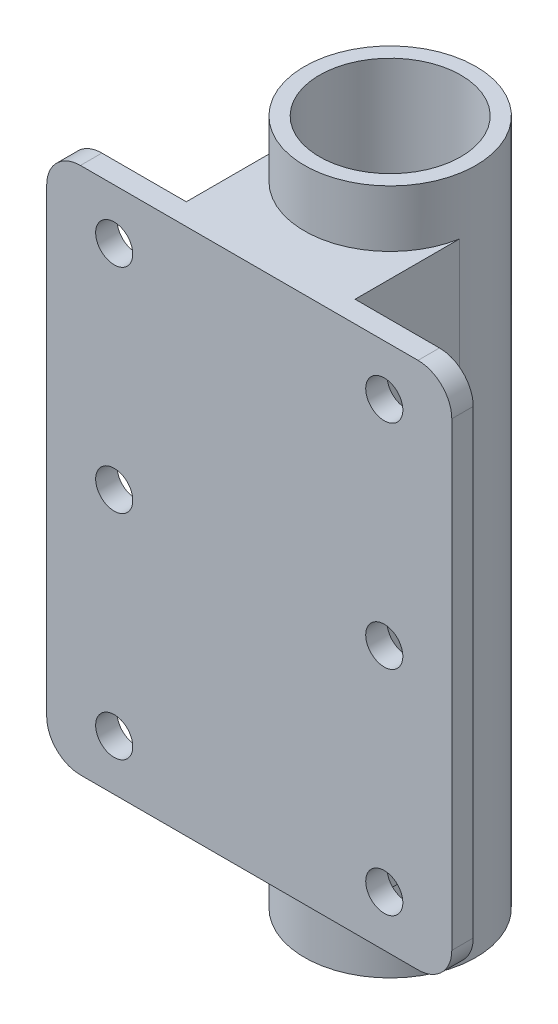
ISO-10303-21;
HEADER;
FILE_DESCRIPTION(('STEP AP214'),'2;1');
FILE_NAME('part.step','',(''),(''),'','','');
FILE_SCHEMA(('AUTOMOTIVE_DESIGN { 1 0 10303 214 1 1 1 1 }'));
ENDSEC;
DATA;
#1=APPLICATION_CONTEXT('core data for automotive mechanical design processes');
#2=APPLICATION_PROTOCOL_DEFINITION('international standard','automotive_design',2000,#1);
#3=PRODUCT_CONTEXT('',#1,'mechanical');
#4=PRODUCT('Part','Part','',(#3));
#5=PRODUCT_RELATED_PRODUCT_CATEGORY('part','',(#4));
#6=PRODUCT_DEFINITION_FORMATION('','',#4);
#7=PRODUCT_DEFINITION_CONTEXT('part definition',#1,'design');
#8=PRODUCT_DEFINITION('design','',#6,#7);
#9=PRODUCT_DEFINITION_SHAPE('','',#8);
#10=(LENGTH_UNIT() NAMED_UNIT(*) SI_UNIT(.MILLI.,.METRE.));
#11=(NAMED_UNIT(*) PLANE_ANGLE_UNIT() SI_UNIT($,.RADIAN.));
#12=(NAMED_UNIT(*) SI_UNIT($,.STERADIAN.) SOLID_ANGLE_UNIT());
#13=UNCERTAINTY_MEASURE_WITH_UNIT(LENGTH_MEASURE(1.E-05),#10,'distance_accuracy_value','');
#14=(GEOMETRIC_REPRESENTATION_CONTEXT(3) GLOBAL_UNCERTAINTY_ASSIGNED_CONTEXT((#13)) GLOBAL_UNIT_ASSIGNED_CONTEXT((#10,
#11,#12)) REPRESENTATION_CONTEXT('',''));
#15=CARTESIAN_POINT('',(0.,0.,0.));
#16=DIRECTION('',(0.,0.,1.));
#17=DIRECTION('',(1.,0.,0.));
#18=AXIS2_PLACEMENT_3D('',#15,#16,#17);
#19=CARTESIAN_POINT('',(0.,0.,0.));
#20=DIRECTION('',(0.,-1.,0.));
#21=DIRECTION('',(0.,0.,-1.));
#22=AXIS2_PLACEMENT_3D('',#19,#20,#21);
#23=CYLINDRICAL_SURFACE('',#22,25.3999999938142);
#24=CARTESIAN_POINT('',(0.,3.11380453483725E-11,0.));
#25=DIRECTION('',(0.,-1.,0.));
#26=DIRECTION('',(0.,0.,-1.));
#27=AXIS2_PLACEMENT_3D('',#24,#25,#26);
#28=CIRCLE('',#27,25.3999999937946);
#29=CARTESIAN_POINT('',(0.,3.11380453483725E-11,-25.3999999937946));
#30=VERTEX_POINT('',#29);
#31=EDGE_CURVE('E245',#30,#30,#28,.T.);
#32=ORIENTED_EDGE('',*,*,#31,.F.);
#33=EDGE_LOOP('',(#32));
#34=FACE_BOUND('',#33,.T.);
#35=CARTESIAN_POINT('',(0.,203.199999999963,0.));
#36=DIRECTION('',(0.,-1.,0.));
#37=DIRECTION('',(0.,0.,-1.));
#38=AXIS2_PLACEMENT_3D('',#35,#36,#37);
#39=CIRCLE('',#38,25.3999999938337);
#40=CARTESIAN_POINT('',(0.,203.199999999963,-25.3999999938337));
#41=VERTEX_POINT('',#40);
#42=EDGE_CURVE('E242',#41,#41,#39,.T.);
#43=ORIENTED_EDGE('',*,*,#42,.T.);
#44=EDGE_LOOP('',(#43));
#45=FACE_BOUND('',#44,.T.);
#46=DIRECTION('',(0.,-1.,0.));
#47=VECTOR('',#46,1.);
#48=CARTESIAN_POINT('',(-25.,214.272647380034,4.48998882902464));
#49=LINE('',#48,#47);
#50=CARTESIAN_POINT('',(-25.,186.374999999963,4.48998882902464));
#51=VERTEX_POINT('',#50);
#52=CARTESIAN_POINT('',(-25.,30.0000000000311,4.48998882902464));
#53=VERTEX_POINT('',#52);
#54=EDGE_CURVE('E179',#51,#53,#49,.T.);
#55=ORIENTED_EDGE('',*,*,#54,.F.);
#56=CARTESIAN_POINT('',(0.,186.374999999963,0.));
#57=DIRECTION('',(0.,-1.,0.));
#58=DIRECTION('',(0.,0.,1.));
#59=AXIS2_PLACEMENT_3D('',#56,#57,#58);
#60=CIRCLE('',#59,25.3999999937946);
#61=CARTESIAN_POINT('',(25.,186.374999999963,4.48998882902464));
#62=VERTEX_POINT('',#61);
#63=EDGE_CURVE('E309',#62,#51,#60,.T.);
#64=ORIENTED_EDGE('',*,*,#63,.F.);
#65=DIRECTION('',(0.,-1.,0.));
#66=VECTOR('',#65,1.);
#67=CARTESIAN_POINT('',(25.,214.272647380034,4.48998882902464));
#68=LINE('',#67,#66);
#69=CARTESIAN_POINT('',(25.,30.0000000000311,4.48998882913527));
#70=VERTEX_POINT('',#69);
#71=EDGE_CURVE('E206',#62,#70,#68,.T.);
#72=ORIENTED_EDGE('',*,*,#71,.T.);
#73=CARTESIAN_POINT('',(0.,30.0000000000311,0.));
#74=DIRECTION('',(0.,-1.,0.));
#75=DIRECTION('',(0.,0.,-1.));
#76=AXIS2_PLACEMENT_3D('',#73,#74,#75);
#77=CIRCLE('',#76,25.3999999937946);
#78=EDGE_CURVE('E200',#70,#53,#77,.T.);
#79=ORIENTED_EDGE('',*,*,#78,.T.);
#80=EDGE_LOOP('',(#55,#64,#72,#79));
#81=FACE_BOUND('',#80,.T.);
#82=ADVANCED_FACE('F48',(#34,#45,#81),#23,.T.);
#83=CARTESIAN_POINT('',(-20.955,3.11393374928046E-11,0.));
#84=DIRECTION('',(0.,1.,0.));
#85=DIRECTION('',(0.,0.,1.));
#86=AXIS2_PLACEMENT_3D('',#83,#84,#85);
#87=PLANE('',#86);
#88=CARTESIAN_POINT('',(0.,3.11406296372367E-11,0.));
#89=DIRECTION('',(0.,-1.,0.));
#90=DIRECTION('',(0.,0.,-1.));
#91=AXIS2_PLACEMENT_3D('',#88,#89,#90);
#92=CIRCLE('',#91,20.955);
#93=CARTESIAN_POINT('',(0.,3.11406296372367E-11,-20.955));
#94=VERTEX_POINT('',#93);
#95=EDGE_CURVE('E223',#94,#94,#92,.T.);
#96=ORIENTED_EDGE('',*,*,#95,.F.);
#97=EDGE_LOOP('',(#96));
#98=FACE_BOUND('',#97,.T.);
#99=ORIENTED_EDGE('',*,*,#31,.T.);
#100=EDGE_LOOP('',(#99));
#101=FACE_BOUND('',#100,.T.);
#102=ADVANCED_FACE('F367',(#98,#101),#87,.F.);
#103=CARTESIAN_POINT('',(-20.9550000000491,203.199999999963,0.));
#104=DIRECTION('',(0.,-1.,0.));
#105=DIRECTION('',(0.,0.,-1.));
#106=AXIS2_PLACEMENT_3D('',#103,#104,#105);
#107=PLANE('',#106);
#108=ORIENTED_EDGE('',*,*,#42,.F.);
#109=EDGE_LOOP('',(#108));
#110=FACE_BOUND('',#109,.T.);
#111=CARTESIAN_POINT('',(0.,203.199999999963,0.));
#112=DIRECTION('',(0.,-1.,0.));
#113=DIRECTION('',(0.,0.,-1.));
#114=AXIS2_PLACEMENT_3D('',#111,#112,#113);
#115=CIRCLE('',#114,20.9550000000491);
#116=CARTESIAN_POINT('',(0.,203.199999999963,-20.9550000000491));
#117=VERTEX_POINT('',#116);
#118=EDGE_CURVE('E239',#117,#117,#115,.T.);
#119=ORIENTED_EDGE('',*,*,#118,.T.);
#120=EDGE_LOOP('',(#119));
#121=FACE_BOUND('',#120,.T.);
#122=ADVANCED_FACE('F372',(#110,#121),#107,.F.);
#123=CARTESIAN_POINT('',(0.,0.,0.));
#124=DIRECTION('',(0.,-1.,0.));
#125=DIRECTION('',(0.,0.,-1.));
#126=AXIS2_PLACEMENT_3D('',#123,#124,#125);
#127=CYLINDRICAL_SURFACE('',#126,20.9550000000491);
#128=ORIENTED_EDGE('',*,*,#118,.F.);
#129=EDGE_LOOP('',(#128));
#130=FACE_BOUND('',#129,.T.);
#131=CARTESIAN_POINT('',(0.,165.099999999963,0.));
#132=DIRECTION('',(0.,-1.,0.));
#133=DIRECTION('',(0.,0.,-1.));
#134=AXIS2_PLACEMENT_3D('',#131,#132,#133);
#135=CIRCLE('',#134,20.9550000000491);
#136=CARTESIAN_POINT('',(0.,165.099999999963,-20.9550000000491));
#137=VERTEX_POINT('',#136);
#138=EDGE_CURVE('E236',#137,#137,#135,.T.);
#139=ORIENTED_EDGE('',*,*,#138,.T.);
#140=EDGE_LOOP('',(#139));
#141=FACE_BOUND('',#140,.T.);
#142=ADVANCED_FACE('F513',(#130,#141),#127,.F.);
#143=CARTESIAN_POINT('',(-19.177000000049,165.099999999963,0.));
#144=DIRECTION('',(0.,-1.,0.));
#145=DIRECTION('',(0.,0.,-1.));
#146=AXIS2_PLACEMENT_3D('',#143,#144,#145);
#147=PLANE('',#146);
#148=ORIENTED_EDGE('',*,*,#138,.F.);
#149=EDGE_LOOP('',(#148));
#150=FACE_BOUND('',#149,.T.);
#151=CARTESIAN_POINT('',(0.,165.099999999963,0.));
#152=DIRECTION('',(0.,-1.,0.));
#153=DIRECTION('',(0.,0.,-1.));
#154=AXIS2_PLACEMENT_3D('',#151,#152,#153);
#155=CIRCLE('',#154,19.177000000049);
#156=CARTESIAN_POINT('',(0.,165.099999999963,-19.177000000049));
#157=VERTEX_POINT('',#156);
#158=EDGE_CURVE('E233',#157,#157,#155,.T.);
#159=ORIENTED_EDGE('',*,*,#158,.T.);
#160=EDGE_LOOP('',(#159));
#161=FACE_BOUND('',#160,.T.);
#162=ADVANCED_FACE('F509',(#150,#161),#147,.F.);
#163=CARTESIAN_POINT('',(0.,0.,0.));
#164=DIRECTION('',(0.,-1.,0.));
#165=DIRECTION('',(0.,0.,-1.));
#166=AXIS2_PLACEMENT_3D('',#163,#164,#165);
#167=CYLINDRICAL_SURFACE('',#166,19.177000000049);
#168=ORIENTED_EDGE('',*,*,#158,.F.);
#169=EDGE_LOOP('',(#168));
#170=FACE_BOUND('',#169,.T.);
#171=CARTESIAN_POINT('',(0.,38.0999999999633,0.));
#172=DIRECTION('',(0.,-1.,0.));
#173=DIRECTION('',(0.,0.,-1.));
#174=AXIS2_PLACEMENT_3D('',#171,#172,#173);
#175=CIRCLE('',#174,19.177000000049);
#176=CARTESIAN_POINT('',(0.,38.0999999999633,-19.177000000049));
#177=VERTEX_POINT('',#176);
#178=EDGE_CURVE('E230',#177,#177,#175,.T.);
#179=ORIENTED_EDGE('',*,*,#178,.T.);
#180=EDGE_LOOP('',(#179));
#181=FACE_BOUND('',#180,.T.);
#182=ADVANCED_FACE('F505',(#170,#181),#167,.F.);
#183=CARTESIAN_POINT('',(-20.955,38.0999999999972,0.));
#184=DIRECTION('',(0.,1.,0.));
#185=DIRECTION('',(0.,0.,1.));
#186=AXIS2_PLACEMENT_3D('',#183,#184,#185);
#187=PLANE('',#186);
#188=ORIENTED_EDGE('',*,*,#178,.F.);
#189=EDGE_LOOP('',(#188));
#190=FACE_BOUND('',#189,.T.);
#191=CARTESIAN_POINT('',(0.,38.1000000000311,0.));
#192=DIRECTION('',(0.,-1.,0.));
#193=DIRECTION('',(0.,0.,-1.));
#194=AXIS2_PLACEMENT_3D('',#191,#192,#193);
#195=CIRCLE('',#194,20.955);
#196=CARTESIAN_POINT('',(0.,38.1000000000311,-20.955));
#197=VERTEX_POINT('',#196);
#198=EDGE_CURVE('E227',#197,#197,#195,.T.);
#199=ORIENTED_EDGE('',*,*,#198,.T.);
#200=EDGE_LOOP('',(#199));
#201=FACE_BOUND('',#200,.T.);
#202=ADVANCED_FACE('F501',(#190,#201),#187,.F.);
#203=CARTESIAN_POINT('',(0.,0.,0.));
#204=DIRECTION('',(0.,-1.,0.));
#205=DIRECTION('',(0.,0.,-1.));
#206=AXIS2_PLACEMENT_3D('',#203,#204,#205);
#207=CYLINDRICAL_SURFACE('',#206,20.955);
#208=ORIENTED_EDGE('',*,*,#198,.F.);
#209=EDGE_LOOP('',(#208));
#210=FACE_BOUND('',#209,.T.);
#211=ORIENTED_EDGE('',*,*,#95,.T.);
#212=EDGE_LOOP('',(#211));
#213=FACE_BOUND('',#212,.T.);
#214=ADVANCED_FACE('F498',(#210,#213),#207,.F.);
#215=CARTESIAN_POINT('',(0.,30.0000000000311,0.));
#216=DIRECTION('',(0.,-1.,0.));
#217=DIRECTION('',(0.,0.,-1.));
#218=AXIS2_PLACEMENT_3D('',#215,#216,#217);
#219=PLANE('',#218);
#220=DIRECTION('',(1.,0.,0.));
#221=VECTOR('',#220,1.);
#222=CARTESIAN_POINT('',(-60.,30.0000000000311,35.3999999937946));
#223=LINE('',#222,#221);
#224=CARTESIAN_POINT('',(25.,30.0000000000311,35.3999999937946));
#225=VERTEX_POINT('',#224);
#226=CARTESIAN_POINT('',(50.,30.0000000000311,35.3999999937946));
#227=VERTEX_POINT('',#226);
#228=EDGE_CURVE('E171',#225,#227,#223,.T.);
#229=ORIENTED_EDGE('',*,*,#228,.T.);
#230=DIRECTION('',(0.,0.,-1.));
#231=VECTOR('',#230,1.);
#232=CARTESIAN_POINT('',(50.,30.0000000000311,41.7499999937946));
#233=LINE('',#232,#231);
#234=CARTESIAN_POINT('',(50.,30.0000000000311,41.7499999937946));
#235=VERTEX_POINT('',#234);
#236=EDGE_CURVE('E12',#227,#235,#233,.F.);
#237=ORIENTED_EDGE('',*,*,#236,.T.);
#238=DIRECTION('',(1.,0.,0.));
#239=VECTOR('',#238,1.);
#240=CARTESIAN_POINT('',(-60.,30.0000000000311,41.7499999937946));
#241=LINE('',#240,#239);
#242=CARTESIAN_POINT('',(-50.,30.0000000000311,41.7499999937946));
#243=VERTEX_POINT('',#242);
#244=EDGE_CURVE('E292',#243,#235,#241,.T.);
#245=ORIENTED_EDGE('',*,*,#244,.F.);
#246=DIRECTION('',(0.,0.,-1.));
#247=VECTOR('',#246,1.);
#248=CARTESIAN_POINT('',(-50.,30.0000000000311,35.3999999937946));
#249=LINE('',#248,#247);
#250=CARTESIAN_POINT('',(-50.,30.0000000000311,35.3999999937946));
#251=VERTEX_POINT('',#250);
#252=EDGE_CURVE('E57',#243,#251,#249,.T.);
#253=ORIENTED_EDGE('',*,*,#252,.T.);
#254=CARTESIAN_POINT('',(-25.,30.0000000000311,35.3999999937946));
#255=VERTEX_POINT('',#254);
#256=EDGE_CURVE('E162',#251,#255,#223,.T.);
#257=ORIENTED_EDGE('',*,*,#256,.T.);
#258=DIRECTION('',(0.,0.,-1.));
#259=VECTOR('',#258,1.);
#260=CARTESIAN_POINT('',(-25.,30.0000000000311,0.));
#261=LINE('',#260,#259);
#262=EDGE_CURVE('E165',#255,#53,#261,.T.);
#263=ORIENTED_EDGE('',*,*,#262,.T.);
#264=ORIENTED_EDGE('',*,*,#78,.F.);
#265=DIRECTION('',(0.,0.,-1.));
#266=VECTOR('',#265,1.);
#267=CARTESIAN_POINT('',(25.,30.0000000000311,0.));
#268=LINE('',#267,#266);
#269=EDGE_CURVE('E197',#225,#70,#268,.T.);
#270=ORIENTED_EDGE('',*,*,#269,.F.);
#271=EDGE_LOOP('',(#229,#237,#245,#253,#257,#263,#264,#270));
#272=FACE_BOUND('',#271,.T.);
#273=ADVANCED_FACE('F164',(#272),#219,.T.);
#274=CARTESIAN_POINT('',(25.,214.272647380034,0.));
#275=DIRECTION('',(-1.,0.,0.));
#276=DIRECTION('',(0.,0.,1.));
#277=AXIS2_PLACEMENT_3D('',#274,#275,#276);
#278=PLANE('',#277);
#279=ORIENTED_EDGE('',*,*,#71,.F.);
#280=DIRECTION('',(0.,0.,-1.));
#281=VECTOR('',#280,1.);
#282=CARTESIAN_POINT('',(25.,186.374999999963,35.3999999937946));
#283=LINE('',#282,#281);
#284=CARTESIAN_POINT('',(25.,186.374999999963,35.3999999937946));
#285=VERTEX_POINT('',#284);
#286=EDGE_CURVE('E195',#285,#62,#283,.T.);
#287=ORIENTED_EDGE('',*,*,#286,.F.);
#288=DIRECTION('',(0.,-1.,0.));
#289=VECTOR('',#288,1.);
#290=CARTESIAN_POINT('',(25.,214.272647380034,35.3999999937946));
#291=LINE('',#290,#289);
#292=EDGE_CURVE('E201',#285,#225,#291,.T.);
#293=ORIENTED_EDGE('',*,*,#292,.T.);
#294=ORIENTED_EDGE('',*,*,#269,.T.);
#295=EDGE_LOOP('',(#279,#287,#293,#294));
#296=FACE_BOUND('',#295,.T.);
#297=ADVANCED_FACE('F380',(#296),#278,.F.);
#298=CARTESIAN_POINT('',(-25.,214.272647380034,0.));
#299=DIRECTION('',(-1.,0.,0.));
#300=DIRECTION('',(0.,0.,1.));
#301=AXIS2_PLACEMENT_3D('',#298,#299,#300);
#302=PLANE('',#301);
#303=DIRECTION('',(0.,-1.,0.));
#304=VECTOR('',#303,1.);
#305=CARTESIAN_POINT('',(-25.,214.272647380034,35.3999999937946));
#306=LINE('',#305,#304);
#307=CARTESIAN_POINT('',(-25.,186.374999999963,35.3999999937946));
#308=VERTEX_POINT('',#307);
#309=EDGE_CURVE('E177',#308,#255,#306,.T.);
#310=ORIENTED_EDGE('',*,*,#309,.F.);
#311=DIRECTION('',(0.,0.,1.));
#312=VECTOR('',#311,1.);
#313=CARTESIAN_POINT('',(-25.,186.374999999963,4.48998882902464));
#314=LINE('',#313,#312);
#315=EDGE_CURVE('E312',#51,#308,#314,.T.);
#316=ORIENTED_EDGE('',*,*,#315,.F.);
#317=ORIENTED_EDGE('',*,*,#54,.T.);
#318=ORIENTED_EDGE('',*,*,#262,.F.);
#319=EDGE_LOOP('',(#310,#316,#317,#318));
#320=FACE_BOUND('',#319,.T.);
#321=ADVANCED_FACE('F175',(#320),#302,.T.);
#322=CARTESIAN_POINT('',(0.,186.374999999963,0.));
#323=DIRECTION('',(0.,1.,0.));
#324=DIRECTION('',(0.,0.,1.));
#325=AXIS2_PLACEMENT_3D('',#322,#323,#324);
#326=PLANE('',#325);
#327=DIRECTION('',(-1.,0.,0.));
#328=VECTOR('',#327,1.);
#329=CARTESIAN_POINT('',(-60.,186.374999999963,35.3999999937946));
#330=LINE('',#329,#328);
#331=CARTESIAN_POINT('',(-50.,186.374999999963,35.3999999937946));
#332=VERTEX_POINT('',#331);
#333=EDGE_CURVE('E187',#308,#332,#330,.T.);
#334=ORIENTED_EDGE('',*,*,#333,.T.);
#335=DIRECTION('',(0.,0.,-1.));
#336=VECTOR('',#335,1.);
#337=CARTESIAN_POINT('',(-50.,186.374999999963,41.7499999937946));
#338=LINE('',#337,#336);
#339=CARTESIAN_POINT('',(-50.,186.374999999963,41.7499999937946));
#340=VERTEX_POINT('',#339);
#341=EDGE_CURVE('E260',#332,#340,#338,.F.);
#342=ORIENTED_EDGE('',*,*,#341,.T.);
#343=DIRECTION('',(-1.,0.,0.));
#344=VECTOR('',#343,1.);
#345=CARTESIAN_POINT('',(-60.,186.374999999963,41.7499999937946));
#346=LINE('',#345,#344);
#347=CARTESIAN_POINT('',(50.,186.374999999963,41.7499999937946));
#348=VERTEX_POINT('',#347);
#349=EDGE_CURVE('E291',#348,#340,#346,.T.);
#350=ORIENTED_EDGE('',*,*,#349,.F.);
#351=DIRECTION('',(0.,0.,-1.));
#352=VECTOR('',#351,1.);
#353=CARTESIAN_POINT('',(50.,186.374999999963,35.3999999937946));
#354=LINE('',#353,#352);
#355=CARTESIAN_POINT('',(50.,186.374999999963,35.3999999937946));
#356=VERTEX_POINT('',#355);
#357=EDGE_CURVE('E257',#348,#356,#354,.T.);
#358=ORIENTED_EDGE('',*,*,#357,.T.);
#359=EDGE_CURVE('E299',#356,#285,#330,.T.);
#360=ORIENTED_EDGE('',*,*,#359,.T.);
#361=ORIENTED_EDGE('',*,*,#286,.T.);
#362=ORIENTED_EDGE('',*,*,#63,.T.);
#363=ORIENTED_EDGE('',*,*,#315,.T.);
#364=EDGE_LOOP('',(#334,#342,#350,#358,#360,#361,#362,#363));
#365=FACE_BOUND('',#364,.T.);
#366=ADVANCED_FACE('F297',(#365),#326,.T.);
#367=CARTESIAN_POINT('',(0.,0.,35.3999999937946));
#368=DIRECTION('',(0.,0.,-1.));
#369=DIRECTION('',(-1.,0.,0.));
#370=AXIS2_PLACEMENT_3D('',#367,#368,#369);
#371=PLANE('',#370);
#372=CARTESIAN_POINT('',(-40.,45.0000000000311,35.3999999937946));
#373=DIRECTION('',(0.,0.,-1.));
#374=DIRECTION('',(-1.,0.,0.));
#375=AXIS2_PLACEMENT_3D('',#372,#373,#374);
#376=CIRCLE('',#375,5.5);
#377=CARTESIAN_POINT('',(-45.5,45.0000000000311,35.3999999937946));
#378=VERTEX_POINT('',#377);
#379=EDGE_CURVE('E426',#378,#378,#376,.T.);
#380=ORIENTED_EDGE('',*,*,#379,.F.);
#381=EDGE_LOOP('',(#380));
#382=FACE_BOUND('',#381,.T.);
#383=CARTESIAN_POINT('',(-40.,108.187499999997,35.3999999937946));
#384=DIRECTION('',(0.,0.,-1.));
#385=DIRECTION('',(-1.,0.,0.));
#386=AXIS2_PLACEMENT_3D('',#383,#384,#385);
#387=CIRCLE('',#386,5.5);
#388=CARTESIAN_POINT('',(-45.5,108.187499999997,35.3999999937946));
#389=VERTEX_POINT('',#388);
#390=EDGE_CURVE('E433',#389,#389,#387,.T.);
#391=ORIENTED_EDGE('',*,*,#390,.F.);
#392=EDGE_LOOP('',(#391));
#393=FACE_BOUND('',#392,.T.);
#394=CARTESIAN_POINT('',(-40.,171.374999999963,35.3999999937946));
#395=DIRECTION('',(0.,0.,-1.));
#396=DIRECTION('',(-1.,0.,0.));
#397=AXIS2_PLACEMENT_3D('',#394,#395,#396);
#398=CIRCLE('',#397,5.5);
#399=CARTESIAN_POINT('',(-45.5,171.374999999963,35.3999999937946));
#400=VERTEX_POINT('',#399);
#401=EDGE_CURVE('E411',#400,#400,#398,.T.);
#402=ORIENTED_EDGE('',*,*,#401,.F.);
#403=EDGE_LOOP('',(#402));
#404=FACE_BOUND('',#403,.T.);
#405=DIRECTION('',(0.,-1.,0.));
#406=VECTOR('',#405,1.);
#407=CARTESIAN_POINT('',(-60.,30.0000000000311,35.3999999937946));
#408=LINE('',#407,#406);
#409=CARTESIAN_POINT('',(-60.,176.374999999963,35.3999999937946));
#410=VERTEX_POINT('',#409);
#411=CARTESIAN_POINT('',(-60.,40.0000000000311,35.3999999937946));
#412=VERTEX_POINT('',#411);
#413=EDGE_CURVE('E383',#410,#412,#408,.T.);
#414=ORIENTED_EDGE('',*,*,#413,.F.);
#415=CARTESIAN_POINT('',(-50.,176.374999999963,35.3999999937946));
#416=DIRECTION('',(0.,0.,-1.));
#417=DIRECTION('',(-1.,0.,0.));
#418=AXIS2_PLACEMENT_3D('',#415,#416,#417);
#419=CIRCLE('',#418,10.);
#420=EDGE_CURVE('E255',#410,#332,#419,.T.);
#421=ORIENTED_EDGE('',*,*,#420,.T.);
#422=ORIENTED_EDGE('',*,*,#333,.F.);
#423=ORIENTED_EDGE('',*,*,#309,.T.);
#424=ORIENTED_EDGE('',*,*,#256,.F.);
#425=CARTESIAN_POINT('',(-50.,40.0000000000311,35.3999999937946));
#426=DIRECTION('',(0.,0.,-1.));
#427=DIRECTION('',(-1.,0.,0.));
#428=AXIS2_PLACEMENT_3D('',#425,#426,#427);
#429=CIRCLE('',#428,10.);
#430=EDGE_CURVE('E253',#251,#412,#429,.T.);
#431=ORIENTED_EDGE('',*,*,#430,.T.);
#432=EDGE_LOOP('',(#414,#421,#422,#423,#424,#431));
#433=FACE_BOUND('',#432,.T.);
#434=ADVANCED_FACE('F185',(#382,#393,#404,#433),#371,.T.);
#435=CARTESIAN_POINT('',(0.,0.,41.7499999937946));
#436=DIRECTION('',(0.,0.,-1.));
#437=DIRECTION('',(-1.,0.,0.));
#438=AXIS2_PLACEMENT_3D('',#435,#436,#437);
#439=PLANE('',#438);
#440=CARTESIAN_POINT('',(-40.,45.0000000000311,41.7499999937946));
#441=DIRECTION('',(0.,0.,-1.));
#442=DIRECTION('',(-1.,0.,0.));
#443=AXIS2_PLACEMENT_3D('',#440,#441,#442);
#444=CIRCLE('',#443,5.5);
#445=CARTESIAN_POINT('',(-45.5,45.0000000000311,41.7499999937946));
#446=VERTEX_POINT('',#445);
#447=EDGE_CURVE('E431',#446,#446,#444,.T.);
#448=ORIENTED_EDGE('',*,*,#447,.T.);
#449=EDGE_LOOP('',(#448));
#450=FACE_BOUND('',#449,.T.);
#451=CARTESIAN_POINT('',(-40.,108.187499999997,41.7499999937946));
#452=DIRECTION('',(0.,0.,-1.));
#453=DIRECTION('',(-1.,0.,0.));
#454=AXIS2_PLACEMENT_3D('',#451,#452,#453);
#455=CIRCLE('',#454,5.5);
#456=CARTESIAN_POINT('',(-45.5,108.187499999997,41.7499999937946));
#457=VERTEX_POINT('',#456);
#458=EDGE_CURVE('E418',#457,#457,#455,.T.);
#459=ORIENTED_EDGE('',*,*,#458,.T.);
#460=EDGE_LOOP('',(#459));
#461=FACE_BOUND('',#460,.T.);
#462=CARTESIAN_POINT('',(-40.,171.374999999963,41.7499999937946));
#463=DIRECTION('',(0.,0.,-1.));
#464=DIRECTION('',(-1.,0.,0.));
#465=AXIS2_PLACEMENT_3D('',#462,#463,#464);
#466=CIRCLE('',#465,5.5);
#467=CARTESIAN_POINT('',(-45.5,171.374999999963,41.7499999937946));
#468=VERTEX_POINT('',#467);
#469=EDGE_CURVE('E417',#468,#468,#466,.T.);
#470=ORIENTED_EDGE('',*,*,#469,.T.);
#471=EDGE_LOOP('',(#470));
#472=FACE_BOUND('',#471,.T.);
#473=CARTESIAN_POINT('',(40.,171.374999999963,41.7499999937946));
#474=DIRECTION('',(0.,0.,-1.));
#475=DIRECTION('',(-1.,0.,0.));
#476=AXIS2_PLACEMENT_3D('',#473,#474,#475);
#477=CIRCLE('',#476,5.5);
#478=CARTESIAN_POINT('',(34.5,171.374999999963,41.7499999937946));
#479=VERTEX_POINT('',#478);
#480=EDGE_CURVE('E404',#479,#479,#477,.T.);
#481=ORIENTED_EDGE('',*,*,#480,.T.);
#482=EDGE_LOOP('',(#481));
#483=FACE_BOUND('',#482,.T.);
#484=CARTESIAN_POINT('',(40.,108.187499999997,41.7499999937946));
#485=DIRECTION('',(0.,0.,-1.));
#486=DIRECTION('',(-1.,0.,0.));
#487=AXIS2_PLACEMENT_3D('',#484,#485,#486);
#488=CIRCLE('',#487,5.5);
#489=CARTESIAN_POINT('',(34.5,108.187499999997,41.7499999937946));
#490=VERTEX_POINT('',#489);
#491=EDGE_CURVE('E396',#490,#490,#488,.T.);
#492=ORIENTED_EDGE('',*,*,#491,.T.);
#493=EDGE_LOOP('',(#492));
#494=FACE_BOUND('',#493,.T.);
#495=CARTESIAN_POINT('',(40.,45.0000000000311,41.7499999937946));
#496=DIRECTION('',(0.,0.,-1.));
#497=DIRECTION('',(-1.,0.,0.));
#498=AXIS2_PLACEMENT_3D('',#495,#496,#497);
#499=CIRCLE('',#498,5.5);
#500=CARTESIAN_POINT('',(34.5,45.0000000000311,41.7499999937946));
#501=VERTEX_POINT('',#500);
#502=EDGE_CURVE('E385',#501,#501,#499,.T.);
#503=ORIENTED_EDGE('',*,*,#502,.T.);
#504=EDGE_LOOP('',(#503));
#505=FACE_BOUND('',#504,.T.);
#506=ORIENTED_EDGE('',*,*,#349,.T.);
#507=CARTESIAN_POINT('',(-50.,176.374999999963,41.7499999937946));
#508=DIRECTION('',(0.,0.,-1.));
#509=DIRECTION('',(-1.,0.,0.));
#510=AXIS2_PLACEMENT_3D('',#507,#508,#509);
#511=CIRCLE('',#510,10.);
#512=CARTESIAN_POINT('',(-60.,176.374999999963,41.7499999937946));
#513=VERTEX_POINT('',#512);
#514=EDGE_CURVE('E268',#340,#513,#511,.F.);
#515=ORIENTED_EDGE('',*,*,#514,.T.);
#516=DIRECTION('',(0.,-1.,0.));
#517=VECTOR('',#516,1.);
#518=CARTESIAN_POINT('',(-60.,30.0000000000311,41.7499999937946));
#519=LINE('',#518,#517);
#520=CARTESIAN_POINT('',(-60.,40.0000000000311,41.7499999937946));
#521=VERTEX_POINT('',#520);
#522=EDGE_CURVE('E303',#513,#521,#519,.T.);
#523=ORIENTED_EDGE('',*,*,#522,.T.);
#524=CARTESIAN_POINT('',(-50.,40.0000000000311,41.7499999937946));
#525=DIRECTION('',(0.,0.,-1.));
#526=DIRECTION('',(-1.,0.,0.));
#527=AXIS2_PLACEMENT_3D('',#524,#525,#526);
#528=CIRCLE('',#527,10.);
#529=EDGE_CURVE('E262',#521,#243,#528,.F.);
#530=ORIENTED_EDGE('',*,*,#529,.T.);
#531=ORIENTED_EDGE('',*,*,#244,.T.);
#532=CARTESIAN_POINT('',(50.,40.0000000000311,41.7499999937946));
#533=DIRECTION('',(0.,0.,-1.));
#534=DIRECTION('',(-1.,0.,0.));
#535=AXIS2_PLACEMENT_3D('',#532,#533,#534);
#536=CIRCLE('',#535,10.);
#537=CARTESIAN_POINT('',(60.,40.0000000000311,41.7499999937946));
#538=VERTEX_POINT('',#537);
#539=EDGE_CURVE('E264',#235,#538,#536,.F.);
#540=ORIENTED_EDGE('',*,*,#539,.T.);
#541=DIRECTION('',(0.,1.,0.));
#542=VECTOR('',#541,1.);
#543=CARTESIAN_POINT('',(60.,30.0000000000311,41.7499999937946));
#544=LINE('',#543,#542);
#545=CARTESIAN_POINT('',(60.,176.374999999963,41.7499999937946));
#546=VERTEX_POINT('',#545);
#547=EDGE_CURVE('E281',#538,#546,#544,.T.);
#548=ORIENTED_EDGE('',*,*,#547,.T.);
#549=CARTESIAN_POINT('',(50.,176.374999999963,41.7499999937946));
#550=DIRECTION('',(0.,0.,-1.));
#551=DIRECTION('',(-1.,0.,0.));
#552=AXIS2_PLACEMENT_3D('',#549,#550,#551);
#553=CIRCLE('',#552,10.);
#554=EDGE_CURVE('E266',#546,#348,#553,.F.);
#555=ORIENTED_EDGE('',*,*,#554,.T.);
#556=EDGE_LOOP('',(#506,#515,#523,#530,#531,#540,#548,#555));
#557=FACE_BOUND('',#556,.T.);
#558=ADVANCED_FACE('F287',(#450,#461,#472,#483,#494,#505,#557),#439,.F.);
#559=CARTESIAN_POINT('',(60.,30.0000000000311,41.7499999937946));
#560=DIRECTION('',(-1.,0.,0.));
#561=DIRECTION('',(0.,0.,1.));
#562=AXIS2_PLACEMENT_3D('',#559,#560,#561);
#563=PLANE('',#562);
#564=DIRECTION('',(0.,1.,0.));
#565=VECTOR('',#564,1.);
#566=CARTESIAN_POINT('',(60.,30.0000000000311,35.3999999937946));
#567=LINE('',#566,#565);
#568=CARTESIAN_POINT('',(60.,40.0000000000311,35.3999999937946));
#569=VERTEX_POINT('',#568);
#570=CARTESIAN_POINT('',(60.,176.374999999963,35.3999999937946));
#571=VERTEX_POINT('',#570);
#572=EDGE_CURVE('E170',#569,#571,#567,.T.);
#573=ORIENTED_EDGE('',*,*,#572,.T.);
#574=DIRECTION('',(0.,0.,-1.));
#575=VECTOR('',#574,1.);
#576=CARTESIAN_POINT('',(60.,176.374999999963,41.7499999937946));
#577=LINE('',#576,#575);
#578=EDGE_CURVE('E275',#571,#546,#577,.F.);
#579=ORIENTED_EDGE('',*,*,#578,.T.);
#580=ORIENTED_EDGE('',*,*,#547,.F.);
#581=DIRECTION('',(0.,0.,-1.));
#582=VECTOR('',#581,1.);
#583=CARTESIAN_POINT('',(60.,40.0000000000311,35.3999999937946));
#584=LINE('',#583,#582);
#585=EDGE_CURVE('E272',#538,#569,#584,.T.);
#586=ORIENTED_EDGE('',*,*,#585,.T.);
#587=EDGE_LOOP('',(#573,#579,#580,#586));
#588=FACE_BOUND('',#587,.T.);
#589=ADVANCED_FACE('F280',(#588),#563,.F.);
#590=CARTESIAN_POINT('',(-60.,30.0000000000311,41.7499999937946));
#591=DIRECTION('',(1.,0.,0.));
#592=DIRECTION('',(0.,0.,-1.));
#593=AXIS2_PLACEMENT_3D('',#590,#591,#592);
#594=PLANE('',#593);
#595=ORIENTED_EDGE('',*,*,#522,.F.);
#596=DIRECTION('',(0.,0.,-1.));
#597=VECTOR('',#596,1.);
#598=CARTESIAN_POINT('',(-60.,176.374999999963,35.3999999937946));
#599=LINE('',#598,#597);
#600=EDGE_CURVE('E250',#513,#410,#599,.T.);
#601=ORIENTED_EDGE('',*,*,#600,.T.);
#602=ORIENTED_EDGE('',*,*,#413,.T.);
#603=DIRECTION('',(0.,0.,-1.));
#604=VECTOR('',#603,1.);
#605=CARTESIAN_POINT('',(-60.,40.0000000000311,41.7499999937946));
#606=LINE('',#605,#604);
#607=EDGE_CURVE('E248',#412,#521,#606,.F.);
#608=ORIENTED_EDGE('',*,*,#607,.T.);
#609=EDGE_LOOP('',(#595,#601,#602,#608));
#610=FACE_BOUND('',#609,.T.);
#611=ADVANCED_FACE('F355',(#610),#594,.F.);
#612=CARTESIAN_POINT('',(40.,171.374999999963,35.3999999937946));
#613=DIRECTION('',(0.,0.,-1.));
#614=DIRECTION('',(-1.,0.,0.));
#615=AXIS2_PLACEMENT_3D('',#612,#613,#614);
#616=CIRCLE('',#615,5.5);
#617=CARTESIAN_POINT('',(34.5,171.374999999963,35.3999999937946));
#618=VERTEX_POINT('',#617);
#619=EDGE_CURVE('E420',#618,#618,#616,.T.);
#620=ORIENTED_EDGE('',*,*,#619,.F.);
#621=EDGE_LOOP('',(#620));
#622=FACE_BOUND('',#621,.T.);
#623=CARTESIAN_POINT('',(40.,108.187499999997,35.3999999937946));
#624=DIRECTION('',(0.,0.,-1.));
#625=DIRECTION('',(-1.,0.,0.));
#626=AXIS2_PLACEMENT_3D('',#623,#624,#625);
#627=CIRCLE('',#626,5.5);
#628=CARTESIAN_POINT('',(34.5,108.187499999997,35.3999999937946));
#629=VERTEX_POINT('',#628);
#630=EDGE_CURVE('E399',#629,#629,#627,.T.);
#631=ORIENTED_EDGE('',*,*,#630,.F.);
#632=EDGE_LOOP('',(#631));
#633=FACE_BOUND('',#632,.T.);
#634=CARTESIAN_POINT('',(40.,45.0000000000311,35.3999999937946));
#635=DIRECTION('',(0.,0.,-1.));
#636=DIRECTION('',(-1.,0.,0.));
#637=AXIS2_PLACEMENT_3D('',#634,#635,#636);
#638=CIRCLE('',#637,5.5);
#639=CARTESIAN_POINT('',(34.5,45.0000000000311,35.3999999937946));
#640=VERTEX_POINT('',#639);
#641=EDGE_CURVE('E391',#640,#640,#638,.T.);
#642=ORIENTED_EDGE('',*,*,#641,.F.);
#643=EDGE_LOOP('',(#642));
#644=FACE_BOUND('',#643,.T.);
#645=ORIENTED_EDGE('',*,*,#359,.F.);
#646=CARTESIAN_POINT('',(50.,176.374999999963,35.3999999937946));
#647=DIRECTION('',(0.,0.,-1.));
#648=DIRECTION('',(-1.,0.,0.));
#649=AXIS2_PLACEMENT_3D('',#646,#647,#648);
#650=CIRCLE('',#649,10.);
#651=EDGE_CURVE('E70',#356,#571,#650,.T.);
#652=ORIENTED_EDGE('',*,*,#651,.T.);
#653=ORIENTED_EDGE('',*,*,#572,.F.);
#654=CARTESIAN_POINT('',(50.,40.0000000000311,35.3999999937946));
#655=DIRECTION('',(0.,0.,-1.));
#656=DIRECTION('',(-1.,0.,0.));
#657=AXIS2_PLACEMENT_3D('',#654,#655,#656);
#658=CIRCLE('',#657,10.);
#659=EDGE_CURVE('E64',#569,#227,#658,.T.);
#660=ORIENTED_EDGE('',*,*,#659,.T.);
#661=ORIENTED_EDGE('',*,*,#228,.F.);
#662=ORIENTED_EDGE('',*,*,#292,.F.);
#663=EDGE_LOOP('',(#645,#652,#653,#660,#661,#662));
#664=FACE_BOUND('',#663,.T.);
#665=ADVANCED_FACE('F302',(#622,#633,#644,#664),#371,.T.);
#666=CARTESIAN_POINT('',(-50.,176.374999999963,41.7499999937946));
#667=DIRECTION('',(0.,0.,1.));
#668=DIRECTION('',(1.,0.,0.));
#669=AXIS2_PLACEMENT_3D('',#666,#667,#668);
#670=CYLINDRICAL_SURFACE('',#669,10.);
#671=ORIENTED_EDGE('',*,*,#514,.F.);
#672=ORIENTED_EDGE('',*,*,#341,.F.);
#673=ORIENTED_EDGE('',*,*,#420,.F.);
#674=ORIENTED_EDGE('',*,*,#600,.F.);
#675=EDGE_LOOP('',(#671,#672,#673,#674));
#676=FACE_BOUND('',#675,.T.);
#677=ADVANCED_FACE('F354',(#676),#670,.T.);
#678=CARTESIAN_POINT('',(50.,176.374999999963,0.));
#679=DIRECTION('',(0.,0.,1.));
#680=DIRECTION('',(1.,0.,0.));
#681=AXIS2_PLACEMENT_3D('',#678,#679,#680);
#682=CYLINDRICAL_SURFACE('',#681,10.);
#683=ORIENTED_EDGE('',*,*,#554,.F.);
#684=ORIENTED_EDGE('',*,*,#578,.F.);
#685=ORIENTED_EDGE('',*,*,#651,.F.);
#686=ORIENTED_EDGE('',*,*,#357,.F.);
#687=EDGE_LOOP('',(#683,#684,#685,#686));
#688=FACE_BOUND('',#687,.T.);
#689=ADVANCED_FACE('F295',(#688),#682,.T.);
#690=CARTESIAN_POINT('',(50.,40.0000000000311,41.7499999937946));
#691=DIRECTION('',(0.,0.,1.));
#692=DIRECTION('',(1.,0.,0.));
#693=AXIS2_PLACEMENT_3D('',#690,#691,#692);
#694=CYLINDRICAL_SURFACE('',#693,10.);
#695=ORIENTED_EDGE('',*,*,#539,.F.);
#696=ORIENTED_EDGE('',*,*,#236,.F.);
#697=ORIENTED_EDGE('',*,*,#659,.F.);
#698=ORIENTED_EDGE('',*,*,#585,.F.);
#699=EDGE_LOOP('',(#695,#696,#697,#698));
#700=FACE_BOUND('',#699,.T.);
#701=ADVANCED_FACE('F600',(#700),#694,.T.);
#702=CARTESIAN_POINT('',(-50.,40.0000000000311,0.));
#703=DIRECTION('',(0.,0.,1.));
#704=DIRECTION('',(1.,0.,0.));
#705=AXIS2_PLACEMENT_3D('',#702,#703,#704);
#706=CYLINDRICAL_SURFACE('',#705,10.);
#707=ORIENTED_EDGE('',*,*,#529,.F.);
#708=ORIENTED_EDGE('',*,*,#607,.F.);
#709=ORIENTED_EDGE('',*,*,#430,.F.);
#710=ORIENTED_EDGE('',*,*,#252,.F.);
#711=EDGE_LOOP('',(#707,#708,#709,#710));
#712=FACE_BOUND('',#711,.T.);
#713=ADVANCED_FACE('F50',(#712),#706,.T.);
#714=CARTESIAN_POINT('',(40.,45.0000000000311,35.3999999937946));
#715=DIRECTION('',(0.,0.,-1.));
#716=DIRECTION('',(-1.,0.,0.));
#717=AXIS2_PLACEMENT_3D('',#714,#715,#716);
#718=CYLINDRICAL_SURFACE('',#717,5.5);
#719=ORIENTED_EDGE('',*,*,#502,.F.);
#720=EDGE_LOOP('',(#719));
#721=FACE_BOUND('',#720,.T.);
#722=ORIENTED_EDGE('',*,*,#641,.T.);
#723=EDGE_LOOP('',(#722));
#724=FACE_BOUND('',#723,.T.);
#725=ADVANCED_FACE('F464',(#721,#724),#718,.F.);
#726=CARTESIAN_POINT('',(40.,108.187499999997,35.3999999937946));
#727=DIRECTION('',(0.,0.,-1.));
#728=DIRECTION('',(-1.,0.,0.));
#729=AXIS2_PLACEMENT_3D('',#726,#727,#728);
#730=CYLINDRICAL_SURFACE('',#729,5.5);
#731=ORIENTED_EDGE('',*,*,#491,.F.);
#732=EDGE_LOOP('',(#731));
#733=FACE_BOUND('',#732,.T.);
#734=ORIENTED_EDGE('',*,*,#630,.T.);
#735=EDGE_LOOP('',(#734));
#736=FACE_BOUND('',#735,.T.);
#737=ADVANCED_FACE('F460',(#733,#736),#730,.F.);
#738=CARTESIAN_POINT('',(40.,171.374999999963,35.3999999937946));
#739=DIRECTION('',(0.,0.,-1.));
#740=DIRECTION('',(-1.,0.,0.));
#741=AXIS2_PLACEMENT_3D('',#738,#739,#740);
#742=CYLINDRICAL_SURFACE('',#741,5.5);
#743=ORIENTED_EDGE('',*,*,#480,.F.);
#744=EDGE_LOOP('',(#743));
#745=FACE_BOUND('',#744,.T.);
#746=ORIENTED_EDGE('',*,*,#619,.T.);
#747=EDGE_LOOP('',(#746));
#748=FACE_BOUND('',#747,.T.);
#749=ADVANCED_FACE('F454',(#745,#748),#742,.F.);
#750=CARTESIAN_POINT('',(-40.,171.374999999963,35.3999999937946));
#751=DIRECTION('',(0.,0.,-1.));
#752=DIRECTION('',(-1.,0.,0.));
#753=AXIS2_PLACEMENT_3D('',#750,#751,#752);
#754=CYLINDRICAL_SURFACE('',#753,5.5);
#755=ORIENTED_EDGE('',*,*,#469,.F.);
#756=EDGE_LOOP('',(#755));
#757=FACE_BOUND('',#756,.T.);
#758=ORIENTED_EDGE('',*,*,#401,.T.);
#759=EDGE_LOOP('',(#758));
#760=FACE_BOUND('',#759,.T.);
#761=ADVANCED_FACE('F447',(#757,#760),#754,.F.);
#762=CARTESIAN_POINT('',(-40.,108.187499999997,35.3999999937946));
#763=DIRECTION('',(0.,0.,-1.));
#764=DIRECTION('',(-1.,0.,0.));
#765=AXIS2_PLACEMENT_3D('',#762,#763,#764);
#766=CYLINDRICAL_SURFACE('',#765,5.5);
#767=ORIENTED_EDGE('',*,*,#458,.F.);
#768=EDGE_LOOP('',(#767));
#769=FACE_BOUND('',#768,.T.);
#770=ORIENTED_EDGE('',*,*,#390,.T.);
#771=EDGE_LOOP('',(#770));
#772=FACE_BOUND('',#771,.T.);
#773=ADVANCED_FACE('F444',(#769,#772),#766,.F.);
#774=CARTESIAN_POINT('',(-40.,45.0000000000311,35.3999999937946));
#775=DIRECTION('',(0.,0.,-1.));
#776=DIRECTION('',(-1.,0.,0.));
#777=AXIS2_PLACEMENT_3D('',#774,#775,#776);
#778=CYLINDRICAL_SURFACE('',#777,5.5);
#779=ORIENTED_EDGE('',*,*,#447,.F.);
#780=EDGE_LOOP('',(#779));
#781=FACE_BOUND('',#780,.T.);
#782=ORIENTED_EDGE('',*,*,#379,.T.);
#783=EDGE_LOOP('',(#782));
#784=FACE_BOUND('',#783,.T.);
#785=ADVANCED_FACE('F446',(#781,#784),#778,.F.);
#786=CLOSED_SHELL('',(#82,#102,#122,#142,#162,#182,#202,#214,#273,#297,#321,#366,#434,#558,#589,
#611,#665,#677,#689,#701,#713,#725,#737,#749,#761,#773,#785));
#787=CARTESIAN_POINT('',(0.,183.199999999963,0.));
#788=DIRECTION('',(0.,-1.,0.));
#789=DIRECTION('',(0.,0.,1.));
#790=AXIS2_PLACEMENT_3D('',#787,#788,#789);
#791=CIRCLE('',#790,25.3999999937946);
#792=CARTESIAN_POINT('',(21.825,183.199999999963,12.9934358306326));
#793=VERTEX_POINT('',#792);
#794=CARTESIAN_POINT('',(-21.825,183.199999999963,12.9934358306326));
#795=VERTEX_POINT('',#794);
#796=EDGE_CURVE('E316',#793,#795,#791,.T.);
#797=ORIENTED_EDGE('',*,*,#796,.T.);
#798=DIRECTION('',(0.,-1.,0.));
#799=VECTOR('',#798,1.);
#800=CARTESIAN_POINT('',(-21.825,214.272647380034,12.9934358306326));
#801=LINE('',#800,#799);
#802=CARTESIAN_POINT('',(-21.825,33.1750000000311,12.9934358306326));
#803=VERTEX_POINT('',#802);
#804=EDGE_CURVE('E189',#795,#803,#801,.T.);
#805=ORIENTED_EDGE('',*,*,#804,.T.);
#806=CARTESIAN_POINT('',(0.,33.1750000000311,0.));
#807=DIRECTION('',(0.,-1.,0.));
#808=DIRECTION('',(0.,0.,-1.));
#809=AXIS2_PLACEMENT_3D('',#806,#807,#808);
#810=CIRCLE('',#809,25.3999999937946);
#811=CARTESIAN_POINT('',(21.825,33.1750000000311,12.9934358306326));
#812=VERTEX_POINT('',#811);
#813=EDGE_CURVE('E214',#812,#803,#810,.T.);
#814=ORIENTED_EDGE('',*,*,#813,.F.);
#815=DIRECTION('',(0.,-1.,0.));
#816=VECTOR('',#815,1.);
#817=CARTESIAN_POINT('',(21.825,214.272647380034,12.9934358306326));
#818=LINE('',#817,#816);
#819=EDGE_CURVE('E205',#793,#812,#818,.T.);
#820=ORIENTED_EDGE('',*,*,#819,.F.);
#821=EDGE_LOOP('',(#797,#805,#814,#820));
#822=FACE_BOUND('',#821,.T.);
#823=ADVANCED_FACE('F323',(#822),#23,.T.);
#824=CARTESIAN_POINT('',(-21.825,214.272647380034,0.));
#825=DIRECTION('',(-1.,0.,0.));
#826=DIRECTION('',(0.,0.,1.));
#827=AXIS2_PLACEMENT_3D('',#824,#825,#826);
#828=PLANE('',#827);
#829=DIRECTION('',(0.,-1.,0.));
#830=VECTOR('',#829,1.);
#831=CARTESIAN_POINT('',(-21.825,214.272647380034,35.3999999937946));
#832=LINE('',#831,#830);
#833=CARTESIAN_POINT('',(-21.825,183.199999999963,35.3999999937946));
#834=VERTEX_POINT('',#833);
#835=CARTESIAN_POINT('',(-21.825,33.1750000000311,35.3999999937946));
#836=VERTEX_POINT('',#835);
#837=EDGE_CURVE('E180',#834,#836,#832,.T.);
#838=ORIENTED_EDGE('',*,*,#837,.T.);
#839=DIRECTION('',(0.,0.,-1.));
#840=VECTOR('',#839,1.);
#841=CARTESIAN_POINT('',(-21.825,33.1750000000311,0.));
#842=LINE('',#841,#840);
#843=EDGE_CURVE('E221',#836,#803,#842,.T.);
#844=ORIENTED_EDGE('',*,*,#843,.T.);
#845=ORIENTED_EDGE('',*,*,#804,.F.);
#846=DIRECTION('',(0.,0.,-1.));
#847=VECTOR('',#846,1.);
#848=CARTESIAN_POINT('',(-21.825,183.199999999963,0.));
#849=LINE('',#848,#847);
#850=EDGE_CURVE('E181',#834,#795,#849,.T.);
#851=ORIENTED_EDGE('',*,*,#850,.F.);
#852=EDGE_LOOP('',(#838,#844,#845,#851));
#853=FACE_BOUND('',#852,.T.);
#854=ADVANCED_FACE('F339',(#853),#828,.F.);
#855=CARTESIAN_POINT('',(0.,33.1750000000311,0.));
#856=DIRECTION('',(0.,-1.,0.));
#857=DIRECTION('',(0.,0.,-1.));
#858=AXIS2_PLACEMENT_3D('',#855,#856,#857);
#859=PLANE('',#858);
#860=ORIENTED_EDGE('',*,*,#813,.T.);
#861=ORIENTED_EDGE('',*,*,#843,.F.);
#862=DIRECTION('',(-1.,0.,0.));
#863=VECTOR('',#862,1.);
#864=CARTESIAN_POINT('',(0.,33.1750000000311,35.3999999937946));
#865=LINE('',#864,#863);
#866=CARTESIAN_POINT('',(21.825,33.1750000000311,35.3999999937946));
#867=VERTEX_POINT('',#866);
#868=EDGE_CURVE('E219',#867,#836,#865,.T.);
#869=ORIENTED_EDGE('',*,*,#868,.F.);
#870=DIRECTION('',(0.,0.,-1.));
#871=VECTOR('',#870,1.);
#872=CARTESIAN_POINT('',(21.825,33.1750000000311,0.));
#873=LINE('',#872,#871);
#874=EDGE_CURVE('E217',#867,#812,#873,.T.);
#875=ORIENTED_EDGE('',*,*,#874,.T.);
#876=EDGE_LOOP('',(#860,#861,#869,#875));
#877=FACE_BOUND('',#876,.T.);
#878=ADVANCED_FACE('F329',(#877),#859,.F.);
#879=CARTESIAN_POINT('',(21.825,214.272647380034,0.));
#880=DIRECTION('',(-1.,0.,0.));
#881=DIRECTION('',(0.,0.,1.));
#882=AXIS2_PLACEMENT_3D('',#879,#880,#881);
#883=PLANE('',#882);
#884=ORIENTED_EDGE('',*,*,#874,.F.);
#885=DIRECTION('',(0.,-1.,0.));
#886=VECTOR('',#885,1.);
#887=CARTESIAN_POINT('',(21.825,214.272647380034,35.3999999937946));
#888=LINE('',#887,#886);
#889=CARTESIAN_POINT('',(21.825,183.199999999963,35.3999999937946));
#890=VERTEX_POINT('',#889);
#891=EDGE_CURVE('E209',#890,#867,#888,.T.);
#892=ORIENTED_EDGE('',*,*,#891,.F.);
#893=DIRECTION('',(0.,0.,-1.));
#894=VECTOR('',#893,1.);
#895=CARTESIAN_POINT('',(21.825,183.199999999963,0.));
#896=LINE('',#895,#894);
#897=EDGE_CURVE('E202',#890,#793,#896,.T.);
#898=ORIENTED_EDGE('',*,*,#897,.T.);
#899=ORIENTED_EDGE('',*,*,#819,.T.);
#900=EDGE_LOOP('',(#884,#892,#898,#899));
#901=FACE_BOUND('',#900,.T.);
#902=ADVANCED_FACE('F334',(#901),#883,.T.);
#903=CARTESIAN_POINT('',(0.,183.199999999963,0.));
#904=DIRECTION('',(0.,1.,0.));
#905=DIRECTION('',(0.,0.,1.));
#906=AXIS2_PLACEMENT_3D('',#903,#904,#905);
#907=PLANE('',#906);
#908=ORIENTED_EDGE('',*,*,#897,.F.);
#909=DIRECTION('',(1.,0.,0.));
#910=VECTOR('',#909,1.);
#911=CARTESIAN_POINT('',(-25.,183.199999999963,35.3999999937946));
#912=LINE('',#911,#910);
#913=EDGE_CURVE('E313',#834,#890,#912,.T.);
#914=ORIENTED_EDGE('',*,*,#913,.F.);
#915=ORIENTED_EDGE('',*,*,#850,.T.);
#916=ORIENTED_EDGE('',*,*,#796,.F.);
#917=EDGE_LOOP('',(#908,#914,#915,#916));
#918=FACE_BOUND('',#917,.T.);
#919=ADVANCED_FACE('F338',(#918),#907,.F.);
#920=ORIENTED_EDGE('',*,*,#837,.F.);
#921=ORIENTED_EDGE('',*,*,#913,.T.);
#922=ORIENTED_EDGE('',*,*,#891,.T.);
#923=ORIENTED_EDGE('',*,*,#868,.T.);
#924=EDGE_LOOP('',(#920,#921,#922,#923));
#925=FACE_BOUND('',#924,.T.);
#926=ADVANCED_FACE('F341',(#925),#371,.T.);
#927=CLOSED_SHELL('',(#823,#854,#878,#902,#919,#926));
#928=ORIENTED_CLOSED_SHELL('',*,#927,.T.);
#929=BREP_WITH_VOIDS('B2',#786,(#928));
#930=ADVANCED_BREP_SHAPE_REPRESENTATION('',(#18,#929),#14);
#931=SHAPE_DEFINITION_REPRESENTATION(#9,#930);
ENDSEC;
END-ISO-10303-21;
